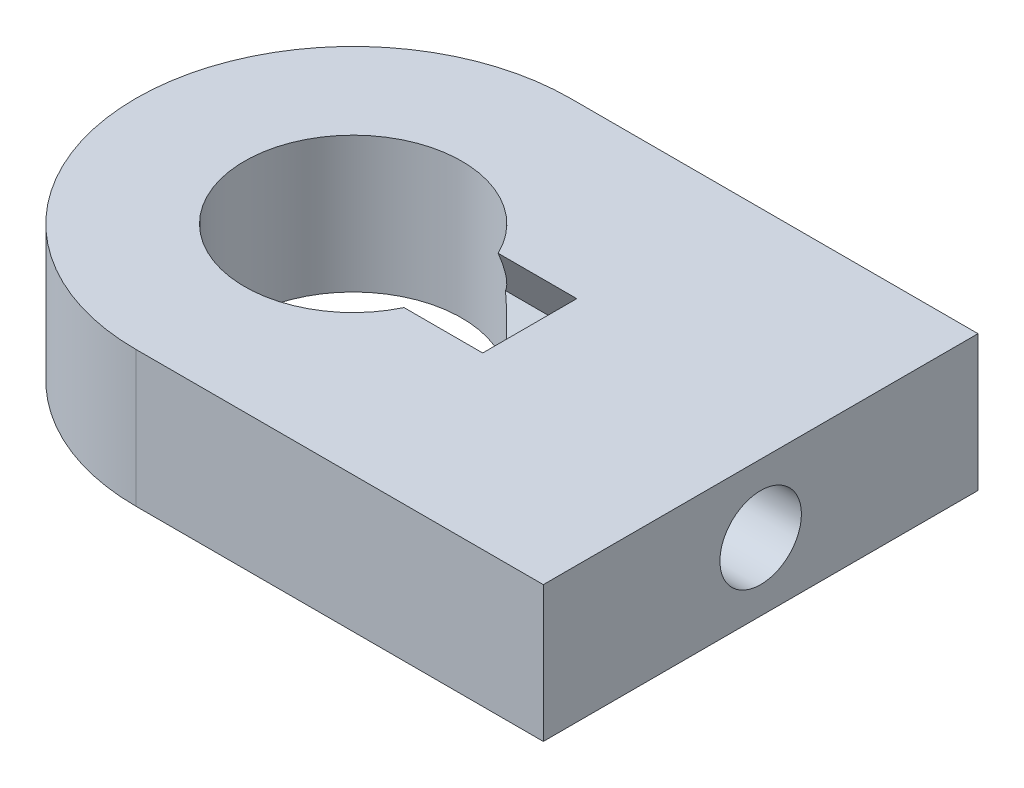
ISO-10303-21;
HEADER;
FILE_DESCRIPTION(('STEP AP214'),'2;1');
FILE_NAME('part.step','',(''),(''),'','','');
FILE_SCHEMA(('AUTOMOTIVE_DESIGN { 1 0 10303 214 1 1 1 1 }'));
ENDSEC;
DATA;
#1=APPLICATION_CONTEXT('core data for automotive mechanical design processes');
#2=APPLICATION_PROTOCOL_DEFINITION('international standard','automotive_design',2000,#1);
#3=PRODUCT_CONTEXT('',#1,'mechanical');
#4=PRODUCT('Part','Part','',(#3));
#5=PRODUCT_RELATED_PRODUCT_CATEGORY('part','',(#4));
#6=PRODUCT_DEFINITION_FORMATION('','',#4);
#7=PRODUCT_DEFINITION_CONTEXT('part definition',#1,'design');
#8=PRODUCT_DEFINITION('design','',#6,#7);
#9=PRODUCT_DEFINITION_SHAPE('','',#8);
#10=(LENGTH_UNIT() NAMED_UNIT(*) SI_UNIT(.MILLI.,.METRE.));
#11=(NAMED_UNIT(*) PLANE_ANGLE_UNIT() SI_UNIT($,.RADIAN.));
#12=(NAMED_UNIT(*) SI_UNIT($,.STERADIAN.) SOLID_ANGLE_UNIT());
#13=UNCERTAINTY_MEASURE_WITH_UNIT(LENGTH_MEASURE(1.E-05),#10,'distance_accuracy_value','');
#14=(GEOMETRIC_REPRESENTATION_CONTEXT(3) GLOBAL_UNCERTAINTY_ASSIGNED_CONTEXT((#13)) GLOBAL_UNIT_ASSIGNED_CONTEXT((#10,
#11,#12)) REPRESENTATION_CONTEXT('',''));
#15=CARTESIAN_POINT('',(0.,0.,0.));
#16=DIRECTION('',(0.,0.,1.));
#17=DIRECTION('',(1.,0.,0.));
#18=AXIS2_PLACEMENT_3D('',#15,#16,#17);
#19=CARTESIAN_POINT('',(0.,5.,0.));
#20=DIRECTION('',(0.,-1.,0.));
#21=DIRECTION('',(0.,0.,-1.));
#22=AXIS2_PLACEMENT_3D('',#19,#20,#21);
#23=PLANE('',#22);
#24=CARTESIAN_POINT('',(0.,5.,0.));
#25=DIRECTION('',(0.,1.,0.));
#26=DIRECTION('',(0.,0.,-1.));
#27=AXIS2_PLACEMENT_3D('',#24,#25,#26);
#28=CIRCLE('',#27,8.);
#29=CARTESIAN_POINT('',(0.,5.,-8.));
#30=VERTEX_POINT('',#29);
#31=CARTESIAN_POINT('',(0.,5.,8.));
#32=VERTEX_POINT('',#31);
#33=EDGE_CURVE('E158',#30,#32,#28,.T.);
#34=ORIENTED_EDGE('',*,*,#33,.T.);
#35=DIRECTION('',(1.,0.,0.));
#36=VECTOR('',#35,1.);
#37=CARTESIAN_POINT('',(15.,5.,8.));
#38=LINE('',#37,#36);
#39=CARTESIAN_POINT('',(15.,5.,8.));
#40=VERTEX_POINT('',#39);
#41=EDGE_CURVE('E86',#32,#40,#38,.T.);
#42=ORIENTED_EDGE('',*,*,#41,.T.);
#43=DIRECTION('',(0.,0.,-1.));
#44=VECTOR('',#43,1.);
#45=CARTESIAN_POINT('',(15.,5.,-8.));
#46=LINE('',#45,#44);
#47=CARTESIAN_POINT('',(15.,5.,-8.));
#48=VERTEX_POINT('',#47);
#49=EDGE_CURVE('E161',#40,#48,#46,.T.);
#50=ORIENTED_EDGE('',*,*,#49,.T.);
#51=DIRECTION('',(-1.,0.,0.));
#52=VECTOR('',#51,1.);
#53=CARTESIAN_POINT('',(0.,5.,-8.));
#54=LINE('',#53,#52);
#55=EDGE_CURVE('E58',#48,#30,#54,.T.);
#56=ORIENTED_EDGE('',*,*,#55,.T.);
#57=EDGE_LOOP('',(#34,#42,#50,#56));
#58=FACE_BOUND('',#57,.T.);
#59=CARTESIAN_POINT('',(0.,5.,0.));
#60=DIRECTION('',(0.,1.,0.));
#61=DIRECTION('',(0.,0.,1.));
#62=AXIS2_PLACEMENT_3D('',#59,#60,#61);
#63=CIRCLE('',#62,4.);
#64=CARTESIAN_POINT('',(3.60555127546399,5.,-1.73205080756888));
#65=VERTEX_POINT('',#64);
#66=CARTESIAN_POINT('',(3.60555127546399,5.,1.73205080756888));
#67=VERTEX_POINT('',#66);
#68=EDGE_CURVE('E137',#65,#67,#63,.T.);
#69=ORIENTED_EDGE('',*,*,#68,.F.);
#70=DIRECTION('',(-1.,0.,0.));
#71=VECTOR('',#70,1.);
#72=CARTESIAN_POINT('',(-8.001,5.,-1.73205080756888));
#73=LINE('',#72,#71);
#74=CARTESIAN_POINT('',(6.5,5.,-1.73205080756888));
#75=VERTEX_POINT('',#74);
#76=EDGE_CURVE('E140',#75,#65,#73,.T.);
#77=ORIENTED_EDGE('',*,*,#76,.F.);
#78=DIRECTION('',(0.,0.,-1.));
#79=VECTOR('',#78,1.);
#80=CARTESIAN_POINT('',(6.5,5.,0.));
#81=LINE('',#80,#79);
#82=CARTESIAN_POINT('',(6.5,5.,1.73205080756888));
#83=VERTEX_POINT('',#82);
#84=EDGE_CURVE('E138',#83,#75,#81,.T.);
#85=ORIENTED_EDGE('',*,*,#84,.F.);
#86=DIRECTION('',(1.,0.,0.));
#87=VECTOR('',#86,1.);
#88=CARTESIAN_POINT('',(-8.001,5.,1.73205080756888));
#89=LINE('',#88,#87);
#90=EDGE_CURVE('E124',#67,#83,#89,.T.);
#91=ORIENTED_EDGE('',*,*,#90,.F.);
#92=EDGE_LOOP('',(#69,#77,#85,#91));
#93=FACE_BOUND('',#92,.T.);
#94=ADVANCED_FACE('F34',(#58,#93),#23,.F.);
#95=CARTESIAN_POINT('',(0.,0.,0.));
#96=DIRECTION('',(0.,-1.,0.));
#97=DIRECTION('',(0.,0.,-1.));
#98=AXIS2_PLACEMENT_3D('',#95,#96,#97);
#99=PLANE('',#98);
#100=DIRECTION('',(1.,0.,0.));
#101=VECTOR('',#100,1.);
#102=CARTESIAN_POINT('',(-8.001,0.,1.73205080756888));
#103=LINE('',#102,#101);
#104=CARTESIAN_POINT('',(3.60555127546399,0.,1.73205080756888));
#105=VERTEX_POINT('',#104);
#106=CARTESIAN_POINT('',(6.5,0.,1.73205080756888));
#107=VERTEX_POINT('',#106);
#108=EDGE_CURVE('E239',#105,#107,#103,.T.);
#109=ORIENTED_EDGE('',*,*,#108,.T.);
#110=DIRECTION('',(0.,0.,-1.));
#111=VECTOR('',#110,1.);
#112=CARTESIAN_POINT('',(6.5,0.,0.));
#113=LINE('',#112,#111);
#114=CARTESIAN_POINT('',(6.5,0.,-1.73205080756888));
#115=VERTEX_POINT('',#114);
#116=EDGE_CURVE('E233',#107,#115,#113,.T.);
#117=ORIENTED_EDGE('',*,*,#116,.T.);
#118=DIRECTION('',(-1.,0.,0.));
#119=VECTOR('',#118,1.);
#120=CARTESIAN_POINT('',(-8.001,0.,-1.73205080756888));
#121=LINE('',#120,#119);
#122=CARTESIAN_POINT('',(3.60555127546399,0.,-1.73205080756888));
#123=VERTEX_POINT('',#122);
#124=EDGE_CURVE('E236',#115,#123,#121,.T.);
#125=ORIENTED_EDGE('',*,*,#124,.T.);
#126=CARTESIAN_POINT('',(0.,0.,0.));
#127=DIRECTION('',(0.,1.,0.));
#128=DIRECTION('',(0.,0.,1.));
#129=AXIS2_PLACEMENT_3D('',#126,#127,#128);
#130=CIRCLE('',#129,4.);
#131=EDGE_CURVE('E147',#123,#105,#130,.T.);
#132=ORIENTED_EDGE('',*,*,#131,.T.);
#133=EDGE_LOOP('',(#109,#117,#125,#132));
#134=FACE_BOUND('',#133,.T.);
#135=CARTESIAN_POINT('',(0.,0.,0.));
#136=DIRECTION('',(0.,1.,0.));
#137=DIRECTION('',(0.,0.,-1.));
#138=AXIS2_PLACEMENT_3D('',#135,#136,#137);
#139=CIRCLE('',#138,8.);
#140=CARTESIAN_POINT('',(0.,0.,-8.));
#141=VERTEX_POINT('',#140);
#142=CARTESIAN_POINT('',(0.,0.,8.));
#143=VERTEX_POINT('',#142);
#144=EDGE_CURVE('E146',#141,#143,#139,.T.);
#145=ORIENTED_EDGE('',*,*,#144,.F.);
#146=DIRECTION('',(-1.,0.,0.));
#147=VECTOR('',#146,1.);
#148=CARTESIAN_POINT('',(0.,0.,-8.));
#149=LINE('',#148,#147);
#150=CARTESIAN_POINT('',(15.,0.,-8.));
#151=VERTEX_POINT('',#150);
#152=EDGE_CURVE('E79',#151,#141,#149,.T.);
#153=ORIENTED_EDGE('',*,*,#152,.F.);
#154=DIRECTION('',(0.,0.,-1.));
#155=VECTOR('',#154,1.);
#156=CARTESIAN_POINT('',(15.,0.,-8.));
#157=LINE('',#156,#155);
#158=CARTESIAN_POINT('',(15.,0.,8.));
#159=VERTEX_POINT('',#158);
#160=EDGE_CURVE('E166',#159,#151,#157,.T.);
#161=ORIENTED_EDGE('',*,*,#160,.F.);
#162=DIRECTION('',(1.,0.,0.));
#163=VECTOR('',#162,1.);
#164=CARTESIAN_POINT('',(15.,0.,8.));
#165=LINE('',#164,#163);
#166=EDGE_CURVE('E150',#143,#159,#165,.T.);
#167=ORIENTED_EDGE('',*,*,#166,.F.);
#168=EDGE_LOOP('',(#145,#153,#161,#167));
#169=FACE_BOUND('',#168,.T.);
#170=ADVANCED_FACE('F179',(#134,#169),#99,.T.);
#171=CARTESIAN_POINT('',(0.,5.,0.));
#172=DIRECTION('',(0.,-1.,0.));
#173=DIRECTION('',(0.,0.,-1.));
#174=AXIS2_PLACEMENT_3D('',#171,#172,#173);
#175=CYLINDRICAL_SURFACE('',#174,8.);
#176=ORIENTED_EDGE('',*,*,#144,.T.);
#177=DIRECTION('',(0.,-1.,0.));
#178=VECTOR('',#177,1.);
#179=CARTESIAN_POINT('',(0.,5.,8.));
#180=LINE('',#179,#178);
#181=EDGE_CURVE('E11',#32,#143,#180,.T.);
#182=ORIENTED_EDGE('',*,*,#181,.F.);
#183=ORIENTED_EDGE('',*,*,#33,.F.);
#184=DIRECTION('',(0.,-1.,0.));
#185=VECTOR('',#184,1.);
#186=CARTESIAN_POINT('',(0.,5.,-8.));
#187=LINE('',#186,#185);
#188=EDGE_CURVE('E163',#30,#141,#187,.T.);
#189=ORIENTED_EDGE('',*,*,#188,.T.);
#190=EDGE_LOOP('',(#176,#182,#183,#189));
#191=FACE_BOUND('',#190,.T.);
#192=ADVANCED_FACE('F36',(#191),#175,.T.);
#193=CARTESIAN_POINT('',(15.,5.,8.));
#194=DIRECTION('',(0.,0.,-1.));
#195=DIRECTION('',(-1.,0.,0.));
#196=AXIS2_PLACEMENT_3D('',#193,#194,#195);
#197=PLANE('',#196);
#198=ORIENTED_EDGE('',*,*,#166,.T.);
#199=DIRECTION('',(0.,-1.,0.));
#200=VECTOR('',#199,1.);
#201=CARTESIAN_POINT('',(15.,5.,8.));
#202=LINE('',#201,#200);
#203=EDGE_CURVE('E42',#40,#159,#202,.T.);
#204=ORIENTED_EDGE('',*,*,#203,.F.);
#205=ORIENTED_EDGE('',*,*,#41,.F.);
#206=ORIENTED_EDGE('',*,*,#181,.T.);
#207=EDGE_LOOP('',(#198,#204,#205,#206));
#208=FACE_BOUND('',#207,.T.);
#209=ADVANCED_FACE('F192',(#208),#197,.F.);
#210=CARTESIAN_POINT('',(15.,5.,-8.));
#211=DIRECTION('',(-1.,0.,0.));
#212=DIRECTION('',(0.,0.,1.));
#213=AXIS2_PLACEMENT_3D('',#210,#211,#212);
#214=PLANE('',#213);
#215=CARTESIAN_POINT('',(15.,2.5,0.));
#216=DIRECTION('',(1.,0.,0.));
#217=DIRECTION('',(0.,0.,-1.));
#218=AXIS2_PLACEMENT_3D('',#215,#216,#217);
#219=CIRCLE('',#218,1.5);
#220=CARTESIAN_POINT('',(15.,2.5,-1.5));
#221=VERTEX_POINT('',#220);
#222=EDGE_CURVE('E153',#221,#221,#219,.T.);
#223=ORIENTED_EDGE('',*,*,#222,.F.);
#224=EDGE_LOOP('',(#223));
#225=FACE_BOUND('',#224,.T.);
#226=ORIENTED_EDGE('',*,*,#160,.T.);
#227=DIRECTION('',(0.,-1.,0.));
#228=VECTOR('',#227,1.);
#229=CARTESIAN_POINT('',(15.,5.,-8.));
#230=LINE('',#229,#228);
#231=EDGE_CURVE('E170',#48,#151,#230,.T.);
#232=ORIENTED_EDGE('',*,*,#231,.F.);
#233=ORIENTED_EDGE('',*,*,#49,.F.);
#234=ORIENTED_EDGE('',*,*,#203,.T.);
#235=EDGE_LOOP('',(#226,#232,#233,#234));
#236=FACE_BOUND('',#235,.T.);
#237=ADVANCED_FACE('F175',(#225,#236),#214,.F.);
#238=CARTESIAN_POINT('',(0.,5.,-8.));
#239=DIRECTION('',(0.,0.,1.));
#240=DIRECTION('',(1.,0.,0.));
#241=AXIS2_PLACEMENT_3D('',#238,#239,#240);
#242=PLANE('',#241);
#243=ORIENTED_EDGE('',*,*,#152,.T.);
#244=ORIENTED_EDGE('',*,*,#188,.F.);
#245=ORIENTED_EDGE('',*,*,#55,.F.);
#246=ORIENTED_EDGE('',*,*,#231,.T.);
#247=EDGE_LOOP('',(#243,#244,#245,#246));
#248=FACE_BOUND('',#247,.T.);
#249=ADVANCED_FACE('F183',(#248),#242,.F.);
#250=CARTESIAN_POINT('',(0.,5.,0.));
#251=DIRECTION('',(0.,-1.,0.));
#252=DIRECTION('',(0.,0.,-1.));
#253=AXIS2_PLACEMENT_3D('',#250,#251,#252);
#254=CYLINDRICAL_SURFACE('',#253,4.);
#255=CARTESIAN_POINT('',(0.,8.,0.));
#256=DIRECTION('',(0.,0.5,0.866025403784439));
#257=DIRECTION('',(0.,-0.866025403784439,0.5));
#258=AXIS2_PLACEMENT_3D('',#255,#256,#257);
#259=ELLIPSE('',#258,8.,4.);
#260=CARTESIAN_POINT('',(2.43241991988774,2.5,3.17542648054294));
#261=VERTEX_POINT('',#260);
#262=EDGE_CURVE('E120',#67,#261,#259,.F.);
#263=ORIENTED_EDGE('',*,*,#262,.T.);
#264=CARTESIAN_POINT('',(0.,-3.,0.));
#265=DIRECTION('',(0.,-0.5,0.866025403784439));
#266=DIRECTION('',(0.,-0.866025403784439,-0.5));
#267=AXIS2_PLACEMENT_3D('',#264,#265,#266);
#268=ELLIPSE('',#267,8.,4.);
#269=EDGE_CURVE('E130',#261,#105,#268,.F.);
#270=ORIENTED_EDGE('',*,*,#269,.T.);
#271=ORIENTED_EDGE('',*,*,#131,.F.);
#272=CARTESIAN_POINT('',(0.,-3.,0.));
#273=DIRECTION('',(0.,-0.5,-0.866025403784439));
#274=DIRECTION('',(0.,-0.866025403784439,0.5));
#275=AXIS2_PLACEMENT_3D('',#272,#273,#274);
#276=ELLIPSE('',#275,8.00000000000001,4.);
#277=CARTESIAN_POINT('',(2.43241991988774,2.5,-3.17542648054294));
#278=VERTEX_POINT('',#277);
#279=EDGE_CURVE('E131',#123,#278,#276,.F.);
#280=ORIENTED_EDGE('',*,*,#279,.T.);
#281=CARTESIAN_POINT('',(0.,8.,0.));
#282=DIRECTION('',(0.,0.5,-0.866025403784439));
#283=DIRECTION('',(0.,-0.866025403784439,-0.5));
#284=AXIS2_PLACEMENT_3D('',#281,#282,#283);
#285=ELLIPSE('',#284,8.,4.);
#286=EDGE_CURVE('E145',#278,#65,#285,.F.);
#287=ORIENTED_EDGE('',*,*,#286,.T.);
#288=ORIENTED_EDGE('',*,*,#68,.T.);
#289=EDGE_LOOP('',(#263,#270,#271,#280,#287,#288));
#290=FACE_BOUND('',#289,.T.);
#291=ADVANCED_FACE('F143',(#290),#254,.F.);
#292=CARTESIAN_POINT('',(-8.001,2.5,0.));
#293=DIRECTION('',(1.,0.,0.));
#294=DIRECTION('',(0.,0.,-1.));
#295=AXIS2_PLACEMENT_3D('',#292,#293,#294);
#296=CYLINDRICAL_SURFACE('',#295,1.5);
#297=CARTESIAN_POINT('',(6.5,2.5,0.));
#298=DIRECTION('',(1.,0.,0.));
#299=DIRECTION('',(0.,0.,-1.));
#300=AXIS2_PLACEMENT_3D('',#297,#298,#299);
#301=CIRCLE('',#300,1.5);
#302=CARTESIAN_POINT('',(6.5,2.5,-1.5));
#303=VERTEX_POINT('',#302);
#304=EDGE_CURVE('E139',#303,#303,#301,.T.);
#305=ORIENTED_EDGE('',*,*,#304,.F.);
#306=EDGE_LOOP('',(#305));
#307=FACE_BOUND('',#306,.T.);
#308=ORIENTED_EDGE('',*,*,#222,.T.);
#309=EDGE_LOOP('',(#308));
#310=FACE_BOUND('',#309,.T.);
#311=ADVANCED_FACE('F190',(#307,#310),#296,.F.);
#312=CARTESIAN_POINT('',(6.5,0.,0.));
#313=DIRECTION('',(1.,0.,0.));
#314=DIRECTION('',(0.,0.,-1.));
#315=AXIS2_PLACEMENT_3D('',#312,#313,#314);
#316=PLANE('',#315);
#317=ORIENTED_EDGE('',*,*,#304,.T.);
#318=EDGE_LOOP('',(#317));
#319=FACE_BOUND('',#318,.T.);
#320=ORIENTED_EDGE('',*,*,#84,.T.);
#321=DIRECTION('',(0.,0.866025403784438,0.5));
#322=VECTOR('',#321,1.);
#323=CARTESIAN_POINT('',(6.5,2.5,-3.17542648054294));
#324=LINE('',#323,#322);
#325=CARTESIAN_POINT('',(6.5,2.5,-3.17542648054294));
#326=VERTEX_POINT('',#325);
#327=EDGE_CURVE('E230',#326,#75,#324,.T.);
#328=ORIENTED_EDGE('',*,*,#327,.F.);
#329=DIRECTION('',(0.,0.866025403784439,-0.5));
#330=VECTOR('',#329,1.);
#331=CARTESIAN_POINT('',(6.5,-0.250000000000001,-1.58771324027147));
#332=LINE('',#331,#330);
#333=EDGE_CURVE('E234',#115,#326,#332,.T.);
#334=ORIENTED_EDGE('',*,*,#333,.F.);
#335=ORIENTED_EDGE('',*,*,#116,.F.);
#336=DIRECTION('',(0.,-0.866025403784438,-0.5));
#337=VECTOR('',#336,1.);
#338=CARTESIAN_POINT('',(6.5,2.5,3.17542648054294));
#339=LINE('',#338,#337);
#340=CARTESIAN_POINT('',(6.5,2.5,3.17542648054294));
#341=VERTEX_POINT('',#340);
#342=EDGE_CURVE('E246',#341,#107,#339,.T.);
#343=ORIENTED_EDGE('',*,*,#342,.F.);
#344=DIRECTION('',(0.,-0.866025403784439,0.5));
#345=VECTOR('',#344,1.);
#346=CARTESIAN_POINT('',(6.5,5.25,1.58771324027147));
#347=LINE('',#346,#345);
#348=EDGE_CURVE('E232',#83,#341,#347,.T.);
#349=ORIENTED_EDGE('',*,*,#348,.F.);
#350=EDGE_LOOP('',(#320,#328,#334,#335,#343,#349));
#351=FACE_BOUND('',#350,.T.);
#352=ADVANCED_FACE('F205',(#319,#351),#316,.F.);
#353=CARTESIAN_POINT('',(-8.001,2.5,-3.17542648054294));
#354=DIRECTION('',(0.,0.5,-0.866025403784439));
#355=DIRECTION('',(0.,0.866025403784439,0.5));
#356=AXIS2_PLACEMENT_3D('',#353,#354,#355);
#357=PLANE('',#356);
#358=ORIENTED_EDGE('',*,*,#76,.T.);
#359=ORIENTED_EDGE('',*,*,#286,.F.);
#360=DIRECTION('',(1.,0.,0.));
#361=VECTOR('',#360,1.);
#362=CARTESIAN_POINT('',(-8.001,2.5,-3.17542648054294));
#363=LINE('',#362,#361);
#364=EDGE_CURVE('E49',#278,#326,#363,.T.);
#365=ORIENTED_EDGE('',*,*,#364,.T.);
#366=ORIENTED_EDGE('',*,*,#327,.T.);
#367=EDGE_LOOP('',(#358,#359,#365,#366));
#368=FACE_BOUND('',#367,.T.);
#369=ADVANCED_FACE('F211',(#368),#357,.F.);
#370=CARTESIAN_POINT('',(-8.001,5.25,1.58771324027147));
#371=DIRECTION('',(0.,0.5,0.866025403784439));
#372=DIRECTION('',(0.,-0.866025403784439,0.5));
#373=AXIS2_PLACEMENT_3D('',#370,#371,#372);
#374=PLANE('',#373);
#375=ORIENTED_EDGE('',*,*,#90,.T.);
#376=ORIENTED_EDGE('',*,*,#348,.T.);
#377=DIRECTION('',(1.,0.,0.));
#378=VECTOR('',#377,1.);
#379=CARTESIAN_POINT('',(-8.001,2.5,3.17542648054294));
#380=LINE('',#379,#378);
#381=EDGE_CURVE('E126',#261,#341,#380,.T.);
#382=ORIENTED_EDGE('',*,*,#381,.F.);
#383=ORIENTED_EDGE('',*,*,#262,.F.);
#384=EDGE_LOOP('',(#375,#376,#382,#383));
#385=FACE_BOUND('',#384,.T.);
#386=ADVANCED_FACE('F122',(#385),#374,.F.);
#387=CARTESIAN_POINT('',(-8.001,2.5,3.17542648054294));
#388=DIRECTION('',(0.,-0.5,0.866025403784439));
#389=DIRECTION('',(0.,-0.866025403784439,-0.5));
#390=AXIS2_PLACEMENT_3D('',#387,#388,#389);
#391=PLANE('',#390);
#392=ORIENTED_EDGE('',*,*,#269,.F.);
#393=ORIENTED_EDGE('',*,*,#381,.T.);
#394=ORIENTED_EDGE('',*,*,#342,.T.);
#395=ORIENTED_EDGE('',*,*,#108,.F.);
#396=EDGE_LOOP('',(#392,#393,#394,#395));
#397=FACE_BOUND('',#396,.T.);
#398=ADVANCED_FACE('F210',(#397),#391,.F.);
#399=CARTESIAN_POINT('',(-8.001,-0.250000000000001,-1.58771324027147));
#400=DIRECTION('',(0.,-0.5,-0.866025403784439));
#401=DIRECTION('',(0.,0.866025403784439,-0.5));
#402=AXIS2_PLACEMENT_3D('',#399,#400,#401);
#403=PLANE('',#402);
#404=ORIENTED_EDGE('',*,*,#333,.T.);
#405=ORIENTED_EDGE('',*,*,#364,.F.);
#406=ORIENTED_EDGE('',*,*,#279,.F.);
#407=ORIENTED_EDGE('',*,*,#124,.F.);
#408=EDGE_LOOP('',(#404,#405,#406,#407));
#409=FACE_BOUND('',#408,.T.);
#410=ADVANCED_FACE('F207',(#409),#403,.F.);
#411=CLOSED_SHELL('',(#94,#170,#192,#209,#237,#249,#291,#311,#352,#369,#386,#398,#410));
#412=MANIFOLD_SOLID_BREP('B2',#411);
#413=ADVANCED_BREP_SHAPE_REPRESENTATION('',(#18,#412),#14);
#414=SHAPE_DEFINITION_REPRESENTATION(#9,#413);
ENDSEC;
END-ISO-10303-21;
